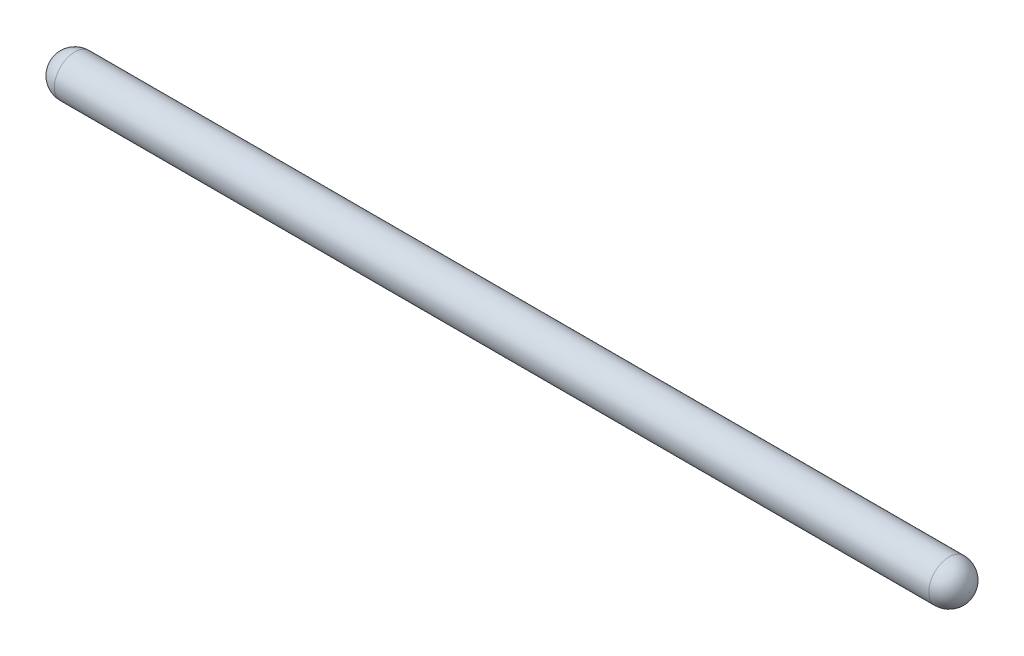
ISO-10303-21;
HEADER;
FILE_DESCRIPTION(('STEP AP214'),'2;1');
FILE_NAME('part.step','',(''),(''),'','','');
FILE_SCHEMA(('AUTOMOTIVE_DESIGN { 1 0 10303 214 1 1 1 1 }'));
ENDSEC;
DATA;
#1=APPLICATION_CONTEXT('core data for automotive mechanical design processes');
#2=APPLICATION_PROTOCOL_DEFINITION('international standard','automotive_design',2000,#1);
#3=PRODUCT_CONTEXT('',#1,'mechanical');
#4=PRODUCT('Part','Part','',(#3));
#5=PRODUCT_RELATED_PRODUCT_CATEGORY('part','',(#4));
#6=PRODUCT_DEFINITION_FORMATION('','',#4);
#7=PRODUCT_DEFINITION_CONTEXT('part definition',#1,'design');
#8=PRODUCT_DEFINITION('design','',#6,#7);
#9=PRODUCT_DEFINITION_SHAPE('','',#8);
#10=(LENGTH_UNIT() NAMED_UNIT(*) SI_UNIT(.MILLI.,.METRE.));
#11=(NAMED_UNIT(*) PLANE_ANGLE_UNIT() SI_UNIT($,.RADIAN.));
#12=(NAMED_UNIT(*) SI_UNIT($,.STERADIAN.) SOLID_ANGLE_UNIT());
#13=UNCERTAINTY_MEASURE_WITH_UNIT(LENGTH_MEASURE(1.E-05),#10,'distance_accuracy_value','');
#14=(GEOMETRIC_REPRESENTATION_CONTEXT(3) GLOBAL_UNCERTAINTY_ASSIGNED_CONTEXT((#13)) GLOBAL_UNIT_ASSIGNED_CONTEXT((#10,
#11,#12)) REPRESENTATION_CONTEXT('',''));
#15=CARTESIAN_POINT('',(0.,0.,0.));
#16=DIRECTION('',(0.,0.,1.));
#17=DIRECTION('',(1.,0.,0.));
#18=AXIS2_PLACEMENT_3D('',#15,#16,#17);
#19=CARTESIAN_POINT('',(371.945677779887,1075.98015972852,1240.68139691651));
#20=DIRECTION('',(1.,0.,0.));
#21=DIRECTION('',(0.,0.,-1.));
#22=AXIS2_PLACEMENT_3D('',#19,#20,#21);
#23=CYLINDRICAL_SURFACE('',#22,15.2222285587176);
#24=CARTESIAN_POINT('',(1036.94567777989,1075.98015972852,1240.68139691651));
#25=DIRECTION('',(1.,0.,0.));
#26=DIRECTION('',(0.,0.,-1.));
#27=AXIS2_PLACEMENT_3D('',#24,#25,#26);
#28=CIRCLE('',#27,15.2222285587176);
#29=CARTESIAN_POINT('',(1036.94567777989,1075.98015972852,1225.4591683578));
#30=VERTEX_POINT('',#29);
#31=EDGE_CURVE('E46',#30,#30,#28,.F.);
#32=ORIENTED_EDGE('',*,*,#31,.T.);
#33=EDGE_LOOP('',(#32));
#34=FACE_BOUND('',#33,.T.);
#35=CARTESIAN_POINT('',(386.945677779887,1075.98015972852,1240.68139691651));
#36=DIRECTION('',(1.,0.,0.));
#37=DIRECTION('',(0.,0.,-1.));
#38=AXIS2_PLACEMENT_3D('',#35,#36,#37);
#39=CIRCLE('',#38,15.2222285587176);
#40=CARTESIAN_POINT('',(386.945677779887,1075.98015972852,1225.4591683578));
#41=VERTEX_POINT('',#40);
#42=EDGE_CURVE('E50',#41,#41,#39,.T.);
#43=ORIENTED_EDGE('',*,*,#42,.T.);
#44=EDGE_LOOP('',(#43));
#45=FACE_BOUND('',#44,.T.);
#46=ADVANCED_FACE('F39',(#34,#45),#23,.T.);
#47=CARTESIAN_POINT('',(371.945677779887,1075.98015972852,1240.68139691651));
#48=DIRECTION('',(1.,0.,0.));
#49=DIRECTION('',(0.,0.,-1.));
#50=AXIS2_PLACEMENT_3D('',#47,#48,#49);
#51=PLANE('',#50);
#52=CARTESIAN_POINT('',(371.945677779887,1075.98015972852,1240.68139691651));
#53=DIRECTION('',(1.,0.,0.));
#54=DIRECTION('',(0.,0.,-1.));
#55=AXIS2_PLACEMENT_3D('',#52,#53,#54);
#56=CIRCLE('',#55,0.222228558717567);
#57=CARTESIAN_POINT('',(371.945677779887,1075.98015972852,1240.4591683578));
#58=VERTEX_POINT('',#57);
#59=EDGE_CURVE('E10',#58,#58,#56,.F.);
#60=ORIENTED_EDGE('',*,*,#59,.T.);
#61=EDGE_LOOP('',(#60));
#62=FACE_BOUND('',#61,.T.);
#63=ADVANCED_FACE('F70',(#62),#51,.F.);
#64=CARTESIAN_POINT('',(1051.94567777989,1075.98015972852,1240.68139691651));
#65=DIRECTION('',(1.,0.,0.));
#66=DIRECTION('',(0.,0.,-1.));
#67=AXIS2_PLACEMENT_3D('',#64,#65,#66);
#68=PLANE('',#67);
#69=CARTESIAN_POINT('',(1051.94567777989,1075.98015972852,1240.68139691651));
#70=DIRECTION('',(1.,0.,0.));
#71=DIRECTION('',(0.,0.,-1.));
#72=AXIS2_PLACEMENT_3D('',#69,#70,#71);
#73=CIRCLE('',#72,0.222228558717567);
#74=CARTESIAN_POINT('',(1051.94567777989,1075.98015972852,1240.4591683578));
#75=VERTEX_POINT('',#74);
#76=EDGE_CURVE('E54',#75,#75,#73,.T.);
#77=ORIENTED_EDGE('',*,*,#76,.T.);
#78=EDGE_LOOP('',(#77));
#79=FACE_BOUND('',#78,.T.);
#80=ADVANCED_FACE('F60',(#79),#68,.T.);
#81=CARTESIAN_POINT('',(1036.94567777989,1075.98015972852,1240.68139691651));
#82=DIRECTION('',(1.,0.,0.));
#83=DIRECTION('',(0.,0.,-1.));
#84=AXIS2_PLACEMENT_3D('',#81,#82,#83);
#85=DEGENERATE_TOROIDAL_SURFACE('',#84,0.222228558717567,15.,.T.);
#86=ORIENTED_EDGE('',*,*,#31,.F.);
#87=EDGE_LOOP('',(#86));
#88=FACE_BOUND('',#87,.T.);
#89=ORIENTED_EDGE('',*,*,#76,.F.);
#90=EDGE_LOOP('',(#89));
#91=FACE_BOUND('',#90,.T.);
#92=ADVANCED_FACE('F62',(#88,#91),#85,.T.);
#93=CARTESIAN_POINT('',(386.945677779887,1075.98015972852,1240.68139691651));
#94=DIRECTION('',(1.,0.,0.));
#95=DIRECTION('',(0.,0.,-1.));
#96=AXIS2_PLACEMENT_3D('',#93,#94,#95);
#97=DEGENERATE_TOROIDAL_SURFACE('',#96,0.222228558717567,15.,.T.);
#98=ORIENTED_EDGE('',*,*,#59,.F.);
#99=EDGE_LOOP('',(#98));
#100=FACE_BOUND('',#99,.T.);
#101=ORIENTED_EDGE('',*,*,#42,.F.);
#102=EDGE_LOOP('',(#101));
#103=FACE_BOUND('',#102,.T.);
#104=ADVANCED_FACE('F41',(#100,#103),#97,.T.);
#105=CLOSED_SHELL('',(#46,#63,#80,#92,#104));
#106=MANIFOLD_SOLID_BREP('B2',#105);
#107=ADVANCED_BREP_SHAPE_REPRESENTATION('',(#18,#106),#14);
#108=SHAPE_DEFINITION_REPRESENTATION(#9,#107);
ENDSEC;
END-ISO-10303-21;
